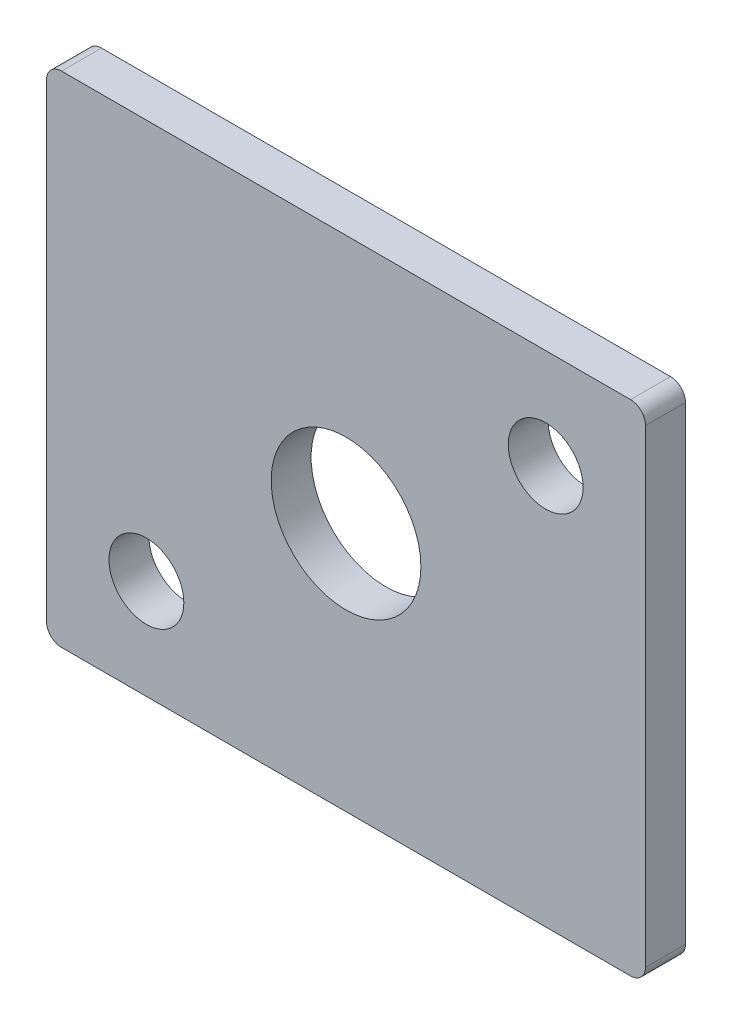
ISO-10303-21;
HEADER;
FILE_DESCRIPTION(('STEP AP214'),'2;1');
FILE_NAME('part.step','',(''),(''),'','','');
FILE_SCHEMA(('AUTOMOTIVE_DESIGN { 1 0 10303 214 1 1 1 1 }'));
ENDSEC;
DATA;
#1=APPLICATION_CONTEXT('core data for automotive mechanical design processes');
#2=APPLICATION_PROTOCOL_DEFINITION('international standard','automotive_design',2000,#1);
#3=PRODUCT_CONTEXT('',#1,'mechanical');
#4=PRODUCT('Part','Part','',(#3));
#5=PRODUCT_RELATED_PRODUCT_CATEGORY('part','',(#4));
#6=PRODUCT_DEFINITION_FORMATION('','',#4);
#7=PRODUCT_DEFINITION_CONTEXT('part definition',#1,'design');
#8=PRODUCT_DEFINITION('design','',#6,#7);
#9=PRODUCT_DEFINITION_SHAPE('','',#8);
#10=(LENGTH_UNIT() NAMED_UNIT(*) SI_UNIT(.MILLI.,.METRE.));
#11=(NAMED_UNIT(*) PLANE_ANGLE_UNIT() SI_UNIT($,.RADIAN.));
#12=(NAMED_UNIT(*) SI_UNIT($,.STERADIAN.) SOLID_ANGLE_UNIT());
#13=UNCERTAINTY_MEASURE_WITH_UNIT(LENGTH_MEASURE(1.E-05),#10,'distance_accuracy_value','');
#14=(GEOMETRIC_REPRESENTATION_CONTEXT(3) GLOBAL_UNCERTAINTY_ASSIGNED_CONTEXT((#13)) GLOBAL_UNIT_ASSIGNED_CONTEXT((#10,
#11,#12)) REPRESENTATION_CONTEXT('',''));
#15=CARTESIAN_POINT('',(0.,0.,0.));
#16=DIRECTION('',(0.,0.,1.));
#17=DIRECTION('',(1.,0.,0.));
#18=AXIS2_PLACEMENT_3D('',#15,#16,#17);
#19=CARTESIAN_POINT('',(0.,0.,0.8));
#20=DIRECTION('',(1.,0.,0.));
#21=DIRECTION('',(0.,0.,-1.));
#22=AXIS2_PLACEMENT_3D('',#19,#20,#21);
#23=PLANE('',#22);
#24=DIRECTION('',(0.,-1.,0.));
#25=VECTOR('',#24,1.);
#26=CARTESIAN_POINT('',(0.,0.,0.));
#27=LINE('',#26,#25);
#28=CARTESIAN_POINT('',(0.,9.7,0.));
#29=VERTEX_POINT('',#28);
#30=CARTESIAN_POINT('',(0.,0.3,0.));
#31=VERTEX_POINT('',#30);
#32=EDGE_CURVE('E135',#29,#31,#27,.T.);
#33=ORIENTED_EDGE('',*,*,#32,.T.);
#34=DIRECTION('',(0.,0.,-1.));
#35=VECTOR('',#34,1.);
#36=CARTESIAN_POINT('',(0.,0.3,0.8));
#37=LINE('',#36,#35);
#38=CARTESIAN_POINT('',(0.,0.3,0.8));
#39=VERTEX_POINT('',#38);
#40=EDGE_CURVE('E113',#31,#39,#37,.F.);
#41=ORIENTED_EDGE('',*,*,#40,.T.);
#42=DIRECTION('',(0.,-1.,0.));
#43=VECTOR('',#42,1.);
#44=CARTESIAN_POINT('',(0.,0.,0.8));
#45=LINE('',#44,#43);
#46=CARTESIAN_POINT('',(0.,9.7,0.8));
#47=VERTEX_POINT('',#46);
#48=EDGE_CURVE('E147',#47,#39,#45,.T.);
#49=ORIENTED_EDGE('',*,*,#48,.F.);
#50=DIRECTION('',(0.,0.,-1.));
#51=VECTOR('',#50,1.);
#52=CARTESIAN_POINT('',(0.,9.7,0.8));
#53=LINE('',#52,#51);
#54=EDGE_CURVE('E118',#47,#29,#53,.T.);
#55=ORIENTED_EDGE('',*,*,#54,.T.);
#56=EDGE_LOOP('',(#33,#41,#49,#55));
#57=FACE_BOUND('',#56,.T.);
#58=ADVANCED_FACE('F39',(#57),#23,.F.);
#59=CARTESIAN_POINT('',(0.,0.,0.8));
#60=DIRECTION('',(0.,1.,0.));
#61=DIRECTION('',(0.,0.,1.));
#62=AXIS2_PLACEMENT_3D('',#59,#60,#61);
#63=PLANE('',#62);
#64=DIRECTION('',(1.,0.,0.));
#65=VECTOR('',#64,1.);
#66=CARTESIAN_POINT('',(0.,0.,0.8));
#67=LINE('',#66,#65);
#68=CARTESIAN_POINT('',(0.3,0.,0.8));
#69=VERTEX_POINT('',#68);
#70=CARTESIAN_POINT('',(11.7,0.,0.8));
#71=VERTEX_POINT('',#70);
#72=EDGE_CURVE('E128',#69,#71,#67,.T.);
#73=ORIENTED_EDGE('',*,*,#72,.F.);
#74=DIRECTION('',(0.,0.,-1.));
#75=VECTOR('',#74,1.);
#76=CARTESIAN_POINT('',(0.3,0.,0.8));
#77=LINE('',#76,#75);
#78=CARTESIAN_POINT('',(0.3,0.,0.));
#79=VERTEX_POINT('',#78);
#80=EDGE_CURVE('E112',#69,#79,#77,.T.);
#81=ORIENTED_EDGE('',*,*,#80,.T.);
#82=DIRECTION('',(1.,0.,0.));
#83=VECTOR('',#82,1.);
#84=CARTESIAN_POINT('',(0.,0.,0.));
#85=LINE('',#84,#83);
#86=CARTESIAN_POINT('',(11.7,0.,0.));
#87=VERTEX_POINT('',#86);
#88=EDGE_CURVE('E125',#79,#87,#85,.T.);
#89=ORIENTED_EDGE('',*,*,#88,.T.);
#90=DIRECTION('',(0.,0.,-1.));
#91=VECTOR('',#90,1.);
#92=CARTESIAN_POINT('',(11.7,0.,0.8));
#93=LINE('',#92,#91);
#94=EDGE_CURVE('E130',#87,#71,#93,.F.);
#95=ORIENTED_EDGE('',*,*,#94,.T.);
#96=EDGE_LOOP('',(#73,#81,#89,#95));
#97=FACE_BOUND('',#96,.T.);
#98=ADVANCED_FACE('F124',(#97),#63,.F.);
#99=CARTESIAN_POINT('',(12.,0.,0.8));
#100=DIRECTION('',(-1.,0.,0.));
#101=DIRECTION('',(0.,0.,1.));
#102=AXIS2_PLACEMENT_3D('',#99,#100,#101);
#103=PLANE('',#102);
#104=DIRECTION('',(0.,1.,0.));
#105=VECTOR('',#104,1.);
#106=CARTESIAN_POINT('',(12.,0.,0.8));
#107=LINE('',#106,#105);
#108=CARTESIAN_POINT('',(12.,0.3,0.8));
#109=VERTEX_POINT('',#108);
#110=CARTESIAN_POINT('',(12.,9.7,0.8));
#111=VERTEX_POINT('',#110);
#112=EDGE_CURVE('E176',#109,#111,#107,.T.);
#113=ORIENTED_EDGE('',*,*,#112,.F.);
#114=DIRECTION('',(0.,0.,-1.));
#115=VECTOR('',#114,1.);
#116=CARTESIAN_POINT('',(12.,0.3,0.8));
#117=LINE('',#116,#115);
#118=CARTESIAN_POINT('',(12.,0.3,0.));
#119=VERTEX_POINT('',#118);
#120=EDGE_CURVE('E169',#109,#119,#117,.T.);
#121=ORIENTED_EDGE('',*,*,#120,.T.);
#122=DIRECTION('',(0.,1.,0.));
#123=VECTOR('',#122,1.);
#124=CARTESIAN_POINT('',(12.,0.,0.));
#125=LINE('',#124,#123);
#126=CARTESIAN_POINT('',(12.,9.7,0.));
#127=VERTEX_POINT('',#126);
#128=EDGE_CURVE('E134',#119,#127,#125,.T.);
#129=ORIENTED_EDGE('',*,*,#128,.T.);
#130=DIRECTION('',(0.,0.,-1.));
#131=VECTOR('',#130,1.);
#132=CARTESIAN_POINT('',(12.,9.7,0.8));
#133=LINE('',#132,#131);
#134=EDGE_CURVE('E167',#127,#111,#133,.F.);
#135=ORIENTED_EDGE('',*,*,#134,.T.);
#136=EDGE_LOOP('',(#113,#121,#129,#135));
#137=FACE_BOUND('',#136,.T.);
#138=ADVANCED_FACE('F195',(#137),#103,.F.);
#139=CARTESIAN_POINT('',(0.,10.,0.8));
#140=DIRECTION('',(0.,-1.,0.));
#141=DIRECTION('',(0.,0.,-1.));
#142=AXIS2_PLACEMENT_3D('',#139,#140,#141);
#143=PLANE('',#142);
#144=DIRECTION('',(-1.,0.,0.));
#145=VECTOR('',#144,1.);
#146=CARTESIAN_POINT('',(0.,10.,0.8));
#147=LINE('',#146,#145);
#148=CARTESIAN_POINT('',(11.7,10.,0.8));
#149=VERTEX_POINT('',#148);
#150=CARTESIAN_POINT('',(0.3,10.,0.8));
#151=VERTEX_POINT('',#150);
#152=EDGE_CURVE('E148',#149,#151,#147,.T.);
#153=ORIENTED_EDGE('',*,*,#152,.F.);
#154=DIRECTION('',(0.,0.,-1.));
#155=VECTOR('',#154,1.);
#156=CARTESIAN_POINT('',(11.7,10.,0.8));
#157=LINE('',#156,#155);
#158=CARTESIAN_POINT('',(11.7,10.,0.));
#159=VERTEX_POINT('',#158);
#160=EDGE_CURVE('E11',#149,#159,#157,.T.);
#161=ORIENTED_EDGE('',*,*,#160,.T.);
#162=DIRECTION('',(-1.,0.,0.));
#163=VECTOR('',#162,1.);
#164=CARTESIAN_POINT('',(0.,10.,0.));
#165=LINE('',#164,#163);
#166=CARTESIAN_POINT('',(0.3,10.,0.));
#167=VERTEX_POINT('',#166);
#168=EDGE_CURVE('E138',#159,#167,#165,.T.);
#169=ORIENTED_EDGE('',*,*,#168,.T.);
#170=DIRECTION('',(0.,0.,-1.));
#171=VECTOR('',#170,1.);
#172=CARTESIAN_POINT('',(0.3,10.,0.8));
#173=LINE('',#172,#171);
#174=EDGE_CURVE('E47',#167,#151,#173,.F.);
#175=ORIENTED_EDGE('',*,*,#174,.T.);
#176=EDGE_LOOP('',(#153,#161,#169,#175));
#177=FACE_BOUND('',#176,.T.);
#178=ADVANCED_FACE('F189',(#177),#143,.F.);
#179=CARTESIAN_POINT('',(0.,0.,0.8));
#180=DIRECTION('',(0.,0.,-1.));
#181=DIRECTION('',(-1.,0.,0.));
#182=AXIS2_PLACEMENT_3D('',#179,#180,#181);
#183=PLANE('',#182);
#184=CARTESIAN_POINT('',(2.,2.,0.8));
#185=DIRECTION('',(0.,0.,1.));
#186=DIRECTION('',(1.,0.,0.));
#187=AXIS2_PLACEMENT_3D('',#184,#185,#186);
#188=CIRCLE('',#187,0.75);
#189=CARTESIAN_POINT('',(2.75,2.,0.8));
#190=VERTEX_POINT('',#189);
#191=EDGE_CURVE('E242',#190,#190,#188,.T.);
#192=ORIENTED_EDGE('',*,*,#191,.F.);
#193=EDGE_LOOP('',(#192));
#194=FACE_BOUND('',#193,.T.);
#195=CARTESIAN_POINT('',(6.,5.,0.8));
#196=DIRECTION('',(0.,0.,1.));
#197=DIRECTION('',(1.,0.,0.));
#198=AXIS2_PLACEMENT_3D('',#195,#196,#197);
#199=CIRCLE('',#198,1.5);
#200=CARTESIAN_POINT('',(7.5,5.,0.8));
#201=VERTEX_POINT('',#200);
#202=EDGE_CURVE('E247',#201,#201,#199,.T.);
#203=ORIENTED_EDGE('',*,*,#202,.F.);
#204=EDGE_LOOP('',(#203));
#205=FACE_BOUND('',#204,.T.);
#206=CARTESIAN_POINT('',(10.,8.,0.8));
#207=DIRECTION('',(0.,0.,1.));
#208=DIRECTION('',(1.,0.,0.));
#209=AXIS2_PLACEMENT_3D('',#206,#207,#208);
#210=CIRCLE('',#209,0.75);
#211=CARTESIAN_POINT('',(10.75,8.,0.8));
#212=VERTEX_POINT('',#211);
#213=EDGE_CURVE('E179',#212,#212,#210,.T.);
#214=ORIENTED_EDGE('',*,*,#213,.F.);
#215=EDGE_LOOP('',(#214));
#216=FACE_BOUND('',#215,.T.);
#217=ORIENTED_EDGE('',*,*,#48,.T.);
#218=CARTESIAN_POINT('',(0.3,0.3,0.8));
#219=DIRECTION('',(0.,0.,-1.));
#220=DIRECTION('',(-1.,0.,0.));
#221=AXIS2_PLACEMENT_3D('',#218,#219,#220);
#222=CIRCLE('',#221,0.3);
#223=EDGE_CURVE('E165',#39,#69,#222,.F.);
#224=ORIENTED_EDGE('',*,*,#223,.T.);
#225=ORIENTED_EDGE('',*,*,#72,.T.);
#226=CARTESIAN_POINT('',(11.7,0.3,0.8));
#227=DIRECTION('',(0.,0.,-1.));
#228=DIRECTION('',(-1.,0.,0.));
#229=AXIS2_PLACEMENT_3D('',#226,#227,#228);
#230=CIRCLE('',#229,0.3);
#231=EDGE_CURVE('E163',#71,#109,#230,.F.);
#232=ORIENTED_EDGE('',*,*,#231,.T.);
#233=ORIENTED_EDGE('',*,*,#112,.T.);
#234=CARTESIAN_POINT('',(11.7,9.7,0.8));
#235=DIRECTION('',(0.,0.,-1.));
#236=DIRECTION('',(-1.,0.,0.));
#237=AXIS2_PLACEMENT_3D('',#234,#235,#236);
#238=CIRCLE('',#237,0.3);
#239=EDGE_CURVE('E60',#111,#149,#238,.F.);
#240=ORIENTED_EDGE('',*,*,#239,.T.);
#241=ORIENTED_EDGE('',*,*,#152,.T.);
#242=CARTESIAN_POINT('',(0.3,9.7,0.8));
#243=DIRECTION('',(0.,0.,-1.));
#244=DIRECTION('',(-1.,0.,0.));
#245=AXIS2_PLACEMENT_3D('',#242,#243,#244);
#246=CIRCLE('',#245,0.3);
#247=EDGE_CURVE('E159',#151,#47,#246,.F.);
#248=ORIENTED_EDGE('',*,*,#247,.T.);
#249=EDGE_LOOP('',(#217,#224,#225,#232,#233,#240,#241,#248));
#250=FACE_BOUND('',#249,.T.);
#251=ADVANCED_FACE('F183',(#194,#205,#216,#250),#183,.F.);
#252=CARTESIAN_POINT('',(0.,0.,0.));
#253=DIRECTION('',(0.,0.,-1.));
#254=DIRECTION('',(-1.,0.,0.));
#255=AXIS2_PLACEMENT_3D('',#252,#253,#254);
#256=PLANE('',#255);
#257=CARTESIAN_POINT('',(2.,2.,0.));
#258=DIRECTION('',(0.,0.,1.));
#259=DIRECTION('',(1.,0.,0.));
#260=AXIS2_PLACEMENT_3D('',#257,#258,#259);
#261=CIRCLE('',#260,0.75);
#262=CARTESIAN_POINT('',(2.75,2.,0.));
#263=VERTEX_POINT('',#262);
#264=EDGE_CURVE('E141',#263,#263,#261,.T.);
#265=ORIENTED_EDGE('',*,*,#264,.T.);
#266=EDGE_LOOP('',(#265));
#267=FACE_BOUND('',#266,.T.);
#268=CARTESIAN_POINT('',(6.,5.,0.));
#269=DIRECTION('',(0.,0.,1.));
#270=DIRECTION('',(1.,0.,0.));
#271=AXIS2_PLACEMENT_3D('',#268,#269,#270);
#272=CIRCLE('',#271,1.5);
#273=CARTESIAN_POINT('',(7.5,5.,0.));
#274=VERTEX_POINT('',#273);
#275=EDGE_CURVE('E243',#274,#274,#272,.T.);
#276=ORIENTED_EDGE('',*,*,#275,.T.);
#277=EDGE_LOOP('',(#276));
#278=FACE_BOUND('',#277,.T.);
#279=CARTESIAN_POINT('',(10.,8.,0.));
#280=DIRECTION('',(0.,0.,1.));
#281=DIRECTION('',(1.,0.,0.));
#282=AXIS2_PLACEMENT_3D('',#279,#280,#281);
#283=CIRCLE('',#282,0.75);
#284=CARTESIAN_POINT('',(10.75,8.,0.));
#285=VERTEX_POINT('',#284);
#286=EDGE_CURVE('E251',#285,#285,#283,.T.);
#287=ORIENTED_EDGE('',*,*,#286,.T.);
#288=EDGE_LOOP('',(#287));
#289=FACE_BOUND('',#288,.T.);
#290=ORIENTED_EDGE('',*,*,#88,.F.);
#291=CARTESIAN_POINT('',(0.3,0.3,0.));
#292=DIRECTION('',(0.,0.,-1.));
#293=DIRECTION('',(-1.,0.,0.));
#294=AXIS2_PLACEMENT_3D('',#291,#292,#293);
#295=CIRCLE('',#294,0.3);
#296=EDGE_CURVE('E108',#79,#31,#295,.T.);
#297=ORIENTED_EDGE('',*,*,#296,.T.);
#298=ORIENTED_EDGE('',*,*,#32,.F.);
#299=CARTESIAN_POINT('',(0.3,9.7,0.));
#300=DIRECTION('',(0.,0.,-1.));
#301=DIRECTION('',(-1.,0.,0.));
#302=AXIS2_PLACEMENT_3D('',#299,#300,#301);
#303=CIRCLE('',#302,0.3);
#304=EDGE_CURVE('E129',#29,#167,#303,.T.);
#305=ORIENTED_EDGE('',*,*,#304,.T.);
#306=ORIENTED_EDGE('',*,*,#168,.F.);
#307=CARTESIAN_POINT('',(11.7,9.7,0.));
#308=DIRECTION('',(0.,0.,-1.));
#309=DIRECTION('',(-1.,0.,0.));
#310=AXIS2_PLACEMENT_3D('',#307,#308,#309);
#311=CIRCLE('',#310,0.3);
#312=EDGE_CURVE('E152',#159,#127,#311,.T.);
#313=ORIENTED_EDGE('',*,*,#312,.T.);
#314=ORIENTED_EDGE('',*,*,#128,.F.);
#315=CARTESIAN_POINT('',(11.7,0.3,0.));
#316=DIRECTION('',(0.,0.,-1.));
#317=DIRECTION('',(-1.,0.,0.));
#318=AXIS2_PLACEMENT_3D('',#315,#316,#317);
#319=CIRCLE('',#318,0.3);
#320=EDGE_CURVE('E119',#119,#87,#319,.T.);
#321=ORIENTED_EDGE('',*,*,#320,.T.);
#322=EDGE_LOOP('',(#290,#297,#298,#305,#306,#313,#314,#321));
#323=FACE_BOUND('',#322,.T.);
#324=ADVANCED_FACE('F132',(#267,#278,#289,#323),#256,.T.);
#325=CARTESIAN_POINT('',(10.,8.,0.));
#326=DIRECTION('',(0.,0.,1.));
#327=DIRECTION('',(1.,0.,0.));
#328=AXIS2_PLACEMENT_3D('',#325,#326,#327);
#329=CYLINDRICAL_SURFACE('',#328,0.75);
#330=ORIENTED_EDGE('',*,*,#286,.F.);
#331=EDGE_LOOP('',(#330));
#332=FACE_BOUND('',#331,.T.);
#333=ORIENTED_EDGE('',*,*,#213,.T.);
#334=EDGE_LOOP('',(#333));
#335=FACE_BOUND('',#334,.T.);
#336=ADVANCED_FACE('F221',(#332,#335),#329,.F.);
#337=CARTESIAN_POINT('',(6.,5.,0.));
#338=DIRECTION('',(0.,0.,1.));
#339=DIRECTION('',(1.,0.,0.));
#340=AXIS2_PLACEMENT_3D('',#337,#338,#339);
#341=CYLINDRICAL_SURFACE('',#340,1.5);
#342=ORIENTED_EDGE('',*,*,#275,.F.);
#343=EDGE_LOOP('',(#342));
#344=FACE_BOUND('',#343,.T.);
#345=ORIENTED_EDGE('',*,*,#202,.T.);
#346=EDGE_LOOP('',(#345));
#347=FACE_BOUND('',#346,.T.);
#348=ADVANCED_FACE('F228',(#344,#347),#341,.F.);
#349=CARTESIAN_POINT('',(2.,2.,0.));
#350=DIRECTION('',(0.,0.,1.));
#351=DIRECTION('',(1.,0.,0.));
#352=AXIS2_PLACEMENT_3D('',#349,#350,#351);
#353=CYLINDRICAL_SURFACE('',#352,0.75);
#354=ORIENTED_EDGE('',*,*,#264,.F.);
#355=EDGE_LOOP('',(#354));
#356=FACE_BOUND('',#355,.T.);
#357=ORIENTED_EDGE('',*,*,#191,.T.);
#358=EDGE_LOOP('',(#357));
#359=FACE_BOUND('',#358,.T.);
#360=ADVANCED_FACE('F206',(#356,#359),#353,.F.);
#361=CARTESIAN_POINT('',(0.3,0.3,0.8));
#362=DIRECTION('',(0.,0.,-1.));
#363=DIRECTION('',(-1.,0.,0.));
#364=AXIS2_PLACEMENT_3D('',#361,#362,#363);
#365=CYLINDRICAL_SURFACE('',#364,0.3);
#366=ORIENTED_EDGE('',*,*,#223,.F.);
#367=ORIENTED_EDGE('',*,*,#40,.F.);
#368=ORIENTED_EDGE('',*,*,#296,.F.);
#369=ORIENTED_EDGE('',*,*,#80,.F.);
#370=EDGE_LOOP('',(#366,#367,#368,#369));
#371=FACE_BOUND('',#370,.T.);
#372=ADVANCED_FACE('F111',(#371),#365,.T.);
#373=CARTESIAN_POINT('',(11.7,0.3,0.8));
#374=DIRECTION('',(0.,0.,-1.));
#375=DIRECTION('',(-1.,0.,0.));
#376=AXIS2_PLACEMENT_3D('',#373,#374,#375);
#377=CYLINDRICAL_SURFACE('',#376,0.3);
#378=ORIENTED_EDGE('',*,*,#231,.F.);
#379=ORIENTED_EDGE('',*,*,#94,.F.);
#380=ORIENTED_EDGE('',*,*,#320,.F.);
#381=ORIENTED_EDGE('',*,*,#120,.F.);
#382=EDGE_LOOP('',(#378,#379,#380,#381));
#383=FACE_BOUND('',#382,.T.);
#384=ADVANCED_FACE('F199',(#383),#377,.T.);
#385=CARTESIAN_POINT('',(11.7,9.7,0.8));
#386=DIRECTION('',(0.,0.,-1.));
#387=DIRECTION('',(-1.,0.,0.));
#388=AXIS2_PLACEMENT_3D('',#385,#386,#387);
#389=CYLINDRICAL_SURFACE('',#388,0.3);
#390=ORIENTED_EDGE('',*,*,#239,.F.);
#391=ORIENTED_EDGE('',*,*,#134,.F.);
#392=ORIENTED_EDGE('',*,*,#312,.F.);
#393=ORIENTED_EDGE('',*,*,#160,.F.);
#394=EDGE_LOOP('',(#390,#391,#392,#393));
#395=FACE_BOUND('',#394,.T.);
#396=ADVANCED_FACE('F191',(#395),#389,.T.);
#397=CARTESIAN_POINT('',(0.3,9.7,0.8));
#398=DIRECTION('',(0.,0.,-1.));
#399=DIRECTION('',(-1.,0.,0.));
#400=AXIS2_PLACEMENT_3D('',#397,#398,#399);
#401=CYLINDRICAL_SURFACE('',#400,0.3);
#402=ORIENTED_EDGE('',*,*,#247,.F.);
#403=ORIENTED_EDGE('',*,*,#174,.F.);
#404=ORIENTED_EDGE('',*,*,#304,.F.);
#405=ORIENTED_EDGE('',*,*,#54,.F.);
#406=EDGE_LOOP('',(#402,#403,#404,#405));
#407=FACE_BOUND('',#406,.T.);
#408=ADVANCED_FACE('F41',(#407),#401,.T.);
#409=CLOSED_SHELL('',(#58,#98,#138,#178,#251,#324,#336,#348,#360,#372,#384,#396,#408));
#410=MANIFOLD_SOLID_BREP('B2',#409);
#411=ADVANCED_BREP_SHAPE_REPRESENTATION('',(#18,#410),#14);
#412=SHAPE_DEFINITION_REPRESENTATION(#9,#411);
ENDSEC;
END-ISO-10303-21;
